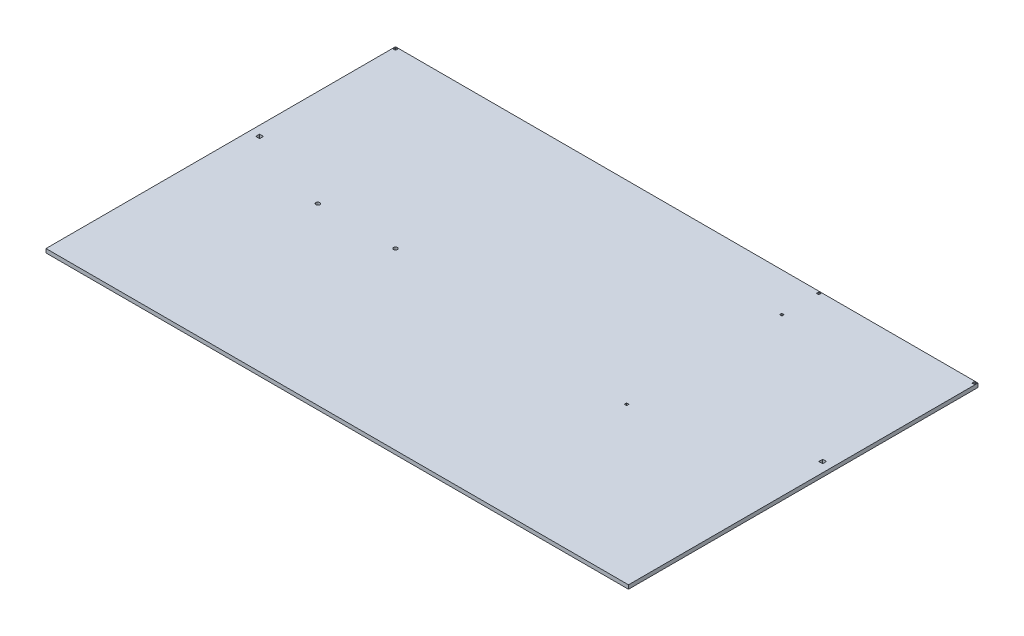
ISO-10303-21;
HEADER;
FILE_DESCRIPTION(('STEP AP214'),'2;1');
FILE_NAME('part.step','',(''),(''),'','','');
FILE_SCHEMA(('AUTOMOTIVE_DESIGN { 1 0 10303 214 1 1 1 1 }'));
ENDSEC;
DATA;
#1=APPLICATION_CONTEXT('core data for automotive mechanical design processes');
#2=APPLICATION_PROTOCOL_DEFINITION('international standard','automotive_design',2000,#1);
#3=PRODUCT_CONTEXT('',#1,'mechanical');
#4=PRODUCT('Part','Part','',(#3));
#5=PRODUCT_RELATED_PRODUCT_CATEGORY('part','',(#4));
#6=PRODUCT_DEFINITION_FORMATION('','',#4);
#7=PRODUCT_DEFINITION_CONTEXT('part definition',#1,'design');
#8=PRODUCT_DEFINITION('design','',#6,#7);
#9=PRODUCT_DEFINITION_SHAPE('','',#8);
#10=(LENGTH_UNIT() NAMED_UNIT(*) SI_UNIT(.MILLI.,.METRE.));
#11=(NAMED_UNIT(*) PLANE_ANGLE_UNIT() SI_UNIT($,.RADIAN.));
#12=(NAMED_UNIT(*) SI_UNIT($,.STERADIAN.) SOLID_ANGLE_UNIT());
#13=UNCERTAINTY_MEASURE_WITH_UNIT(LENGTH_MEASURE(1.E-05),#10,'distance_accuracy_value','');
#14=(GEOMETRIC_REPRESENTATION_CONTEXT(3) GLOBAL_UNCERTAINTY_ASSIGNED_CONTEXT((#13)) GLOBAL_UNIT_ASSIGNED_CONTEXT((#10,
#11,#12)) REPRESENTATION_CONTEXT('',''));
#15=CARTESIAN_POINT('',(0.,0.,0.));
#16=DIRECTION('',(0.,0.,1.));
#17=DIRECTION('',(1.,0.,0.));
#18=AXIS2_PLACEMENT_3D('',#15,#16,#17);
#19=CARTESIAN_POINT('',(-375.,5.,-220.));
#20=DIRECTION('',(0.,-1.,0.));
#21=DIRECTION('',(0.,0.,-1.));
#22=AXIS2_PLACEMENT_3D('',#19,#20,#21);
#23=PLANE('',#22);
#24=DIRECTION('',(-1.,0.,0.));
#25=VECTOR('',#24,1.);
#26=CARTESIAN_POINT('',(-374.,5.,-224.));
#27=LINE('',#26,#25);
#28=CARTESIAN_POINT('',(-371.,5.,-224.));
#29=VERTEX_POINT('',#28);
#30=CARTESIAN_POINT('',(-374.,5.,-224.));
#31=VERTEX_POINT('',#30);
#32=EDGE_CURVE('E289',#29,#31,#27,.T.);
#33=ORIENTED_EDGE('',*,*,#32,.F.);
#34=DIRECTION('',(0.,0.,-1.));
#35=VECTOR('',#34,1.);
#36=CARTESIAN_POINT('',(-371.,5.,-224.));
#37=LINE('',#36,#35);
#38=CARTESIAN_POINT('',(-371.,5.,-221.));
#39=VERTEX_POINT('',#38);
#40=EDGE_CURVE('E58',#39,#29,#37,.T.);
#41=ORIENTED_EDGE('',*,*,#40,.F.);
#42=DIRECTION('',(1.,0.,0.));
#43=VECTOR('',#42,1.);
#44=CARTESIAN_POINT('',(-374.,5.,-221.));
#45=LINE('',#44,#43);
#46=CARTESIAN_POINT('',(-374.,5.,-221.));
#47=VERTEX_POINT('',#46);
#48=EDGE_CURVE('E276',#47,#39,#45,.T.);
#49=ORIENTED_EDGE('',*,*,#48,.F.);
#50=DIRECTION('',(0.,0.,1.));
#51=VECTOR('',#50,1.);
#52=CARTESIAN_POINT('',(-374.,5.,-224.));
#53=LINE('',#52,#51);
#54=EDGE_CURVE('E280',#31,#47,#53,.T.);
#55=ORIENTED_EDGE('',*,*,#54,.F.);
#56=EDGE_LOOP('',(#33,#41,#49,#55));
#57=FACE_BOUND('',#56,.T.);
#58=DIRECTION('',(-1.,0.,0.));
#59=VECTOR('',#58,1.);
#60=CARTESIAN_POINT('',(171.,5.,-176.5));
#61=LINE('',#60,#59);
#62=CARTESIAN_POINT('',(174.,5.,-176.5));
#63=VERTEX_POINT('',#62);
#64=CARTESIAN_POINT('',(171.,5.,-176.5));
#65=VERTEX_POINT('',#64);
#66=EDGE_CURVE('E372',#63,#65,#61,.T.);
#67=ORIENTED_EDGE('',*,*,#66,.F.);
#68=DIRECTION('',(0.,0.,-1.));
#69=VECTOR('',#68,1.);
#70=CARTESIAN_POINT('',(174.,5.,-176.5));
#71=LINE('',#70,#69);
#72=CARTESIAN_POINT('',(174.,5.,-173.5));
#73=VERTEX_POINT('',#72);
#74=EDGE_CURVE('E66',#73,#63,#71,.T.);
#75=ORIENTED_EDGE('',*,*,#74,.F.);
#76=DIRECTION('',(1.,0.,0.));
#77=VECTOR('',#76,1.);
#78=CARTESIAN_POINT('',(171.,5.,-173.5));
#79=LINE('',#78,#77);
#80=CARTESIAN_POINT('',(171.,5.,-173.5));
#81=VERTEX_POINT('',#80);
#82=EDGE_CURVE('E363',#81,#73,#79,.T.);
#83=ORIENTED_EDGE('',*,*,#82,.F.);
#84=DIRECTION('',(0.,0.,1.));
#85=VECTOR('',#84,1.);
#86=CARTESIAN_POINT('',(171.,5.,-176.5));
#87=LINE('',#86,#85);
#88=EDGE_CURVE('E367',#65,#81,#87,.T.);
#89=ORIENTED_EDGE('',*,*,#88,.F.);
#90=EDGE_LOOP('',(#67,#75,#83,#89));
#91=FACE_BOUND('',#90,.T.);
#92=DIRECTION('',(-1.,0.,0.));
#93=VECTOR('',#92,1.);
#94=CARTESIAN_POINT('',(171.,5.,-224.));
#95=LINE('',#94,#93);
#96=CARTESIAN_POINT('',(174.,5.,-224.));
#97=VERTEX_POINT('',#96);
#98=CARTESIAN_POINT('',(171.,5.,-224.));
#99=VERTEX_POINT('',#98);
#100=EDGE_CURVE('E328',#97,#99,#95,.T.);
#101=ORIENTED_EDGE('',*,*,#100,.F.);
#102=DIRECTION('',(0.,0.,-1.));
#103=VECTOR('',#102,1.);
#104=CARTESIAN_POINT('',(174.,5.,-224.));
#105=LINE('',#104,#103);
#106=CARTESIAN_POINT('',(174.,5.,-221.));
#107=VERTEX_POINT('',#106);
#108=EDGE_CURVE('E332',#107,#97,#105,.T.);
#109=ORIENTED_EDGE('',*,*,#108,.F.);
#110=DIRECTION('',(1.,0.,0.));
#111=VECTOR('',#110,1.);
#112=CARTESIAN_POINT('',(171.,5.,-221.));
#113=LINE('',#112,#111);
#114=CARTESIAN_POINT('',(171.,5.,-221.));
#115=VERTEX_POINT('',#114);
#116=EDGE_CURVE('E319',#115,#107,#113,.T.);
#117=ORIENTED_EDGE('',*,*,#116,.F.);
#118=DIRECTION('',(0.,0.,1.));
#119=VECTOR('',#118,1.);
#120=CARTESIAN_POINT('',(171.,5.,-224.));
#121=LINE('',#120,#119);
#122=EDGE_CURVE('E323',#99,#115,#121,.T.);
#123=ORIENTED_EDGE('',*,*,#122,.F.);
#124=EDGE_LOOP('',(#101,#109,#117,#123));
#125=FACE_BOUND('',#124,.T.);
#126=DIRECTION('',(-1.,0.,0.));
#127=VECTOR('',#126,1.);
#128=CARTESIAN_POINT('',(171.,5.,23.5));
#129=LINE('',#128,#127);
#130=CARTESIAN_POINT('',(174.,5.,23.5));
#131=VERTEX_POINT('',#130);
#132=CARTESIAN_POINT('',(171.,5.,23.5));
#133=VERTEX_POINT('',#132);
#134=EDGE_CURVE('E458',#131,#133,#129,.T.);
#135=ORIENTED_EDGE('',*,*,#134,.F.);
#136=DIRECTION('',(0.,0.,-1.));
#137=VECTOR('',#136,1.);
#138=CARTESIAN_POINT('',(174.,5.,23.5));
#139=LINE('',#138,#137);
#140=CARTESIAN_POINT('',(174.,5.,26.5));
#141=VERTEX_POINT('',#140);
#142=EDGE_CURVE('E406',#141,#131,#139,.T.);
#143=ORIENTED_EDGE('',*,*,#142,.F.);
#144=DIRECTION('',(1.,0.,0.));
#145=VECTOR('',#144,1.);
#146=CARTESIAN_POINT('',(171.,5.,26.5));
#147=LINE('',#146,#145);
#148=CARTESIAN_POINT('',(171.,5.,26.5));
#149=VERTEX_POINT('',#148);
#150=EDGE_CURVE('E449',#149,#141,#147,.T.);
#151=ORIENTED_EDGE('',*,*,#150,.F.);
#152=DIRECTION('',(0.,0.,1.));
#153=VECTOR('',#152,1.);
#154=CARTESIAN_POINT('',(171.,5.,23.5));
#155=LINE('',#154,#153);
#156=EDGE_CURVE('E453',#133,#149,#155,.T.);
#157=ORIENTED_EDGE('',*,*,#156,.F.);
#158=EDGE_LOOP('',(#135,#143,#151,#157));
#159=FACE_BOUND('',#158,.T.);
#160=DIRECTION('',(-1.,0.,0.));
#161=VECTOR('',#160,1.);
#162=CARTESIAN_POINT('',(371.,5.,-224.));
#163=LINE('',#162,#161);
#164=CARTESIAN_POINT('',(374.,5.,-224.));
#165=VERTEX_POINT('',#164);
#166=CARTESIAN_POINT('',(371.,5.,-224.));
#167=VERTEX_POINT('',#166);
#168=EDGE_CURVE('E416',#165,#167,#163,.T.);
#169=ORIENTED_EDGE('',*,*,#168,.F.);
#170=DIRECTION('',(0.,0.,-1.));
#171=VECTOR('',#170,1.);
#172=CARTESIAN_POINT('',(374.,5.,-224.));
#173=LINE('',#172,#171);
#174=CARTESIAN_POINT('',(374.,5.,-221.));
#175=VERTEX_POINT('',#174);
#176=EDGE_CURVE('E290',#175,#165,#173,.T.);
#177=ORIENTED_EDGE('',*,*,#176,.F.);
#178=DIRECTION('',(1.,0.,0.));
#179=VECTOR('',#178,1.);
#180=CARTESIAN_POINT('',(371.,5.,-221.));
#181=LINE('',#180,#179);
#182=CARTESIAN_POINT('',(371.,5.,-221.));
#183=VERTEX_POINT('',#182);
#184=EDGE_CURVE('E407',#183,#175,#181,.T.);
#185=ORIENTED_EDGE('',*,*,#184,.F.);
#186=DIRECTION('',(0.,0.,1.));
#187=VECTOR('',#186,1.);
#188=CARTESIAN_POINT('',(371.,5.,-224.));
#189=LINE('',#188,#187);
#190=EDGE_CURVE('E411',#167,#183,#189,.T.);
#191=ORIENTED_EDGE('',*,*,#190,.F.);
#192=EDGE_LOOP('',(#169,#177,#185,#191));
#193=FACE_BOUND('',#192,.T.);
#194=CARTESIAN_POINT('',(-250.,5.,0.));
#195=DIRECTION('',(0.,1.,0.));
#196=DIRECTION('',(0.,0.,1.));
#197=AXIS2_PLACEMENT_3D('',#194,#195,#196);
#198=CIRCLE('',#197,2.5);
#199=CARTESIAN_POINT('',(-250.,5.,2.5));
#200=VERTEX_POINT('',#199);
#201=EDGE_CURVE('E483',#200,#200,#198,.T.);
#202=ORIENTED_EDGE('',*,*,#201,.F.);
#203=EDGE_LOOP('',(#202));
#204=FACE_BOUND('',#203,.T.);
#205=CARTESIAN_POINT('',(-150.,5.,0.));
#206=DIRECTION('',(0.,1.,0.));
#207=DIRECTION('',(0.,0.,1.));
#208=AXIS2_PLACEMENT_3D('',#205,#206,#207);
#209=CIRCLE('',#208,2.5);
#210=CARTESIAN_POINT('',(-150.,5.,2.5));
#211=VERTEX_POINT('',#210);
#212=EDGE_CURVE('E487',#211,#211,#209,.T.);
#213=ORIENTED_EDGE('',*,*,#212,.F.);
#214=EDGE_LOOP('',(#213));
#215=FACE_BOUND('',#214,.T.);
#216=DIRECTION('',(-1.,0.,0.));
#217=VECTOR('',#216,1.);
#218=CARTESIAN_POINT('',(-375.,5.,-35.0000000000001));
#219=LINE('',#218,#217);
#220=CARTESIAN_POINT('',(-360.,5.,-35.0000000000001));
#221=VERTEX_POINT('',#220);
#222=CARTESIAN_POINT('',(-365.,5.,-35.0000000000001));
#223=VERTEX_POINT('',#222);
#224=EDGE_CURVE('E571',#221,#223,#219,.T.);
#225=ORIENTED_EDGE('',*,*,#224,.T.);
#226=DIRECTION('',(0.,0.,-1.));
#227=VECTOR('',#226,1.);
#228=CARTESIAN_POINT('',(-364.999999999998,5.,-220.));
#229=LINE('',#228,#227);
#230=CARTESIAN_POINT('',(-365.,5.,-40.0000000000001));
#231=VERTEX_POINT('',#230);
#232=EDGE_CURVE('E583',#223,#231,#229,.T.);
#233=ORIENTED_EDGE('',*,*,#232,.T.);
#234=DIRECTION('',(1.,0.,0.));
#235=VECTOR('',#234,1.);
#236=CARTESIAN_POINT('',(-375.,5.,-40.0000000000001));
#237=LINE('',#236,#235);
#238=CARTESIAN_POINT('',(-360.,5.,-40.0000000000001));
#239=VERTEX_POINT('',#238);
#240=EDGE_CURVE('E579',#231,#239,#237,.T.);
#241=ORIENTED_EDGE('',*,*,#240,.T.);
#242=DIRECTION('',(0.,0.,1.));
#243=VECTOR('',#242,1.);
#244=CARTESIAN_POINT('',(-360.,5.,-220.));
#245=LINE('',#244,#243);
#246=EDGE_CURVE('E575',#239,#221,#245,.T.);
#247=ORIENTED_EDGE('',*,*,#246,.T.);
#248=EDGE_LOOP('',(#225,#233,#241,#247));
#249=FACE_BOUND('',#248,.T.);
#250=DIRECTION('',(-1.,0.,0.));
#251=VECTOR('',#250,1.);
#252=CARTESIAN_POINT('',(-375.,5.,-35.0000000000001));
#253=LINE('',#252,#251);
#254=CARTESIAN_POINT('',(365.,5.,-35.0000000000001));
#255=VERTEX_POINT('',#254);
#256=CARTESIAN_POINT('',(360.,5.,-35.0000000000001));
#257=VERTEX_POINT('',#256);
#258=EDGE_CURVE('E516',#255,#257,#253,.T.);
#259=ORIENTED_EDGE('',*,*,#258,.T.);
#260=DIRECTION('',(0.,0.,-1.));
#261=VECTOR('',#260,1.);
#262=CARTESIAN_POINT('',(360.,5.,-220.));
#263=LINE('',#262,#261);
#264=CARTESIAN_POINT('',(360.,5.,-40.0000000000001));
#265=VERTEX_POINT('',#264);
#266=EDGE_CURVE('E567',#257,#265,#263,.T.);
#267=ORIENTED_EDGE('',*,*,#266,.T.);
#268=DIRECTION('',(1.,0.,0.));
#269=VECTOR('',#268,1.);
#270=CARTESIAN_POINT('',(-375.,5.,-40.0000000000001));
#271=LINE('',#270,#269);
#272=CARTESIAN_POINT('',(365.,5.,-40.0000000000001));
#273=VERTEX_POINT('',#272);
#274=EDGE_CURVE('E563',#265,#273,#271,.T.);
#275=ORIENTED_EDGE('',*,*,#274,.T.);
#276=DIRECTION('',(0.,0.,1.));
#277=VECTOR('',#276,1.);
#278=CARTESIAN_POINT('',(365.,5.,-220.));
#279=LINE('',#278,#277);
#280=EDGE_CURVE('E559',#273,#255,#279,.T.);
#281=ORIENTED_EDGE('',*,*,#280,.T.);
#282=EDGE_LOOP('',(#259,#267,#275,#281));
#283=FACE_BOUND('',#282,.T.);
#284=DIRECTION('',(-1.,0.,0.));
#285=VECTOR('',#284,1.);
#286=CARTESIAN_POINT('',(-375.,5.,-225.));
#287=LINE('',#286,#285);
#288=CARTESIAN_POINT('',(375.,5.,-225.));
#289=VERTEX_POINT('',#288);
#290=CARTESIAN_POINT('',(-375.,5.,-225.));
#291=VERTEX_POINT('',#290);
#292=EDGE_CURVE('E11',#289,#291,#287,.T.);
#293=ORIENTED_EDGE('',*,*,#292,.T.);
#294=DIRECTION('',(0.,0.,1.));
#295=VECTOR('',#294,1.);
#296=CARTESIAN_POINT('',(-375.,5.,-220.));
#297=LINE('',#296,#295);
#298=CARTESIAN_POINT('',(-375.,5.,225.));
#299=VERTEX_POINT('',#298);
#300=EDGE_CURVE('E590',#291,#299,#297,.T.);
#301=ORIENTED_EDGE('',*,*,#300,.T.);
#302=DIRECTION('',(1.,0.,0.));
#303=VECTOR('',#302,1.);
#304=CARTESIAN_POINT('',(-375.,5.,225.));
#305=LINE('',#304,#303);
#306=CARTESIAN_POINT('',(375.,5.,225.));
#307=VERTEX_POINT('',#306);
#308=EDGE_CURVE('E587',#299,#307,#305,.T.);
#309=ORIENTED_EDGE('',*,*,#308,.T.);
#310=DIRECTION('',(0.,0.,1.));
#311=VECTOR('',#310,1.);
#312=CARTESIAN_POINT('',(375.,5.,-220.));
#313=LINE('',#312,#311);
#314=EDGE_CURVE('E591',#289,#307,#313,.T.);
#315=ORIENTED_EDGE('',*,*,#314,.F.);
#316=EDGE_LOOP('',(#293,#301,#309,#315));
#317=FACE_BOUND('',#316,.T.);
#318=ADVANCED_FACE('F42',(#57,#91,#125,#159,#193,#204,#215,#249,#283,#317),#23,.F.);
#319=CARTESIAN_POINT('',(360.,0.,-40.0000000000001));
#320=DIRECTION('',(0.,0.,-1.));
#321=DIRECTION('',(-1.,0.,0.));
#322=AXIS2_PLACEMENT_3D('',#319,#320,#321);
#323=PLANE('',#322);
#324=DIRECTION('',(0.,1.,0.));
#325=VECTOR('',#324,1.);
#326=CARTESIAN_POINT('',(360.,0.,-40.0000000000001));
#327=LINE('',#326,#325);
#328=CARTESIAN_POINT('',(360.,0.,-40.0000000000001));
#329=VERTEX_POINT('',#328);
#330=EDGE_CURVE('E482',#329,#265,#327,.T.);
#331=ORIENTED_EDGE('',*,*,#330,.F.);
#332=DIRECTION('',(-1.,0.,0.));
#333=VECTOR('',#332,1.);
#334=CARTESIAN_POINT('',(360.,0.,-40.0000000000001));
#335=LINE('',#334,#333);
#336=CARTESIAN_POINT('',(365.,0.,-40.0000000000001));
#337=VERTEX_POINT('',#336);
#338=EDGE_CURVE('E530',#337,#329,#335,.T.);
#339=ORIENTED_EDGE('',*,*,#338,.F.);
#340=DIRECTION('',(0.,1.,0.));
#341=VECTOR('',#340,1.);
#342=CARTESIAN_POINT('',(365.,0.,-40.0000000000001));
#343=LINE('',#342,#341);
#344=EDGE_CURVE('E535',#337,#273,#343,.T.);
#345=ORIENTED_EDGE('',*,*,#344,.T.);
#346=ORIENTED_EDGE('',*,*,#274,.F.);
#347=EDGE_LOOP('',(#331,#339,#345,#346));
#348=FACE_BOUND('',#347,.T.);
#349=ADVANCED_FACE('F642',(#348),#323,.F.);
#350=CARTESIAN_POINT('',(360.,0.,-40.0000000000001));
#351=DIRECTION('',(-1.,0.,0.));
#352=DIRECTION('',(0.,0.,1.));
#353=AXIS2_PLACEMENT_3D('',#350,#351,#352);
#354=PLANE('',#353);
#355=DIRECTION('',(0.,1.,0.));
#356=VECTOR('',#355,1.);
#357=CARTESIAN_POINT('',(360.,0.,-35.0000000000001));
#358=LINE('',#357,#356);
#359=CARTESIAN_POINT('',(360.,0.,-35.0000000000001));
#360=VERTEX_POINT('',#359);
#361=EDGE_CURVE('E527',#360,#257,#358,.T.);
#362=ORIENTED_EDGE('',*,*,#361,.F.);
#363=DIRECTION('',(0.,0.,1.));
#364=VECTOR('',#363,1.);
#365=CARTESIAN_POINT('',(360.,0.,-40.0000000000001));
#366=LINE('',#365,#364);
#367=EDGE_CURVE('E499',#329,#360,#366,.T.);
#368=ORIENTED_EDGE('',*,*,#367,.F.);
#369=ORIENTED_EDGE('',*,*,#330,.T.);
#370=ORIENTED_EDGE('',*,*,#266,.F.);
#371=EDGE_LOOP('',(#362,#368,#369,#370));
#372=FACE_BOUND('',#371,.T.);
#373=ADVANCED_FACE('F648',(#372),#354,.F.);
#374=CARTESIAN_POINT('',(-365.,0.,-40.0000000000001));
#375=DIRECTION('',(0.,0.,-1.));
#376=DIRECTION('',(-1.,0.,0.));
#377=AXIS2_PLACEMENT_3D('',#374,#375,#376);
#378=PLANE('',#377);
#379=DIRECTION('',(0.,1.,0.));
#380=VECTOR('',#379,1.);
#381=CARTESIAN_POINT('',(-365.,0.,-40.0000000000001));
#382=LINE('',#381,#380);
#383=CARTESIAN_POINT('',(-365.,0.,-40.0000000000001));
#384=VERTEX_POINT('',#383);
#385=EDGE_CURVE('E512',#384,#231,#382,.T.);
#386=ORIENTED_EDGE('',*,*,#385,.F.);
#387=DIRECTION('',(-1.,0.,0.));
#388=VECTOR('',#387,1.);
#389=CARTESIAN_POINT('',(-365.,0.,-40.0000000000001));
#390=LINE('',#389,#388);
#391=CARTESIAN_POINT('',(-360.,0.,-40.0000000000001));
#392=VERTEX_POINT('',#391);
#393=EDGE_CURVE('E507',#392,#384,#390,.T.);
#394=ORIENTED_EDGE('',*,*,#393,.F.);
#395=DIRECTION('',(0.,1.,0.));
#396=VECTOR('',#395,1.);
#397=CARTESIAN_POINT('',(-360.,0.,-40.0000000000001));
#398=LINE('',#397,#396);
#399=EDGE_CURVE('E517',#392,#239,#398,.T.);
#400=ORIENTED_EDGE('',*,*,#399,.T.);
#401=ORIENTED_EDGE('',*,*,#240,.F.);
#402=EDGE_LOOP('',(#386,#394,#400,#401));
#403=FACE_BOUND('',#402,.T.);
#404=ADVANCED_FACE('F676',(#403),#378,.F.);
#405=CARTESIAN_POINT('',(-365.,0.,-40.0000000000001));
#406=DIRECTION('',(-1.,0.,0.));
#407=DIRECTION('',(0.,0.,1.));
#408=AXIS2_PLACEMENT_3D('',#405,#406,#407);
#409=PLANE('',#408);
#410=DIRECTION('',(0.,1.,0.));
#411=VECTOR('',#410,1.);
#412=CARTESIAN_POINT('',(-365.,0.,-35.0000000000001));
#413=LINE('',#412,#411);
#414=CARTESIAN_POINT('',(-365.,0.,-35.0000000000001));
#415=VERTEX_POINT('',#414);
#416=EDGE_CURVE('E511',#415,#223,#413,.T.);
#417=ORIENTED_EDGE('',*,*,#416,.F.);
#418=DIRECTION('',(0.,0.,1.));
#419=VECTOR('',#418,1.);
#420=CARTESIAN_POINT('',(-365.,0.,-40.0000000000001));
#421=LINE('',#420,#419);
#422=EDGE_CURVE('E494',#384,#415,#421,.T.);
#423=ORIENTED_EDGE('',*,*,#422,.F.);
#424=ORIENTED_EDGE('',*,*,#385,.T.);
#425=ORIENTED_EDGE('',*,*,#232,.F.);
#426=EDGE_LOOP('',(#417,#423,#424,#425));
#427=FACE_BOUND('',#426,.T.);
#428=ADVANCED_FACE('F668',(#427),#409,.F.);
#429=CARTESIAN_POINT('',(0.,0.,0.));
#430=DIRECTION('',(0.,1.,0.));
#431=DIRECTION('',(0.,0.,1.));
#432=AXIS2_PLACEMENT_3D('',#429,#430,#431);
#433=PLANE('',#432);
#434=DIRECTION('',(1.,0.,0.));
#435=VECTOR('',#434,1.);
#436=CARTESIAN_POINT('',(-374.,0.,-221.));
#437=LINE('',#436,#435);
#438=CARTESIAN_POINT('',(-374.,0.,-221.));
#439=VERTEX_POINT('',#438);
#440=CARTESIAN_POINT('',(-371.,0.,-221.));
#441=VERTEX_POINT('',#440);
#442=EDGE_CURVE('E261',#439,#441,#437,.T.);
#443=ORIENTED_EDGE('',*,*,#442,.T.);
#444=DIRECTION('',(0.,0.,-1.));
#445=VECTOR('',#444,1.);
#446=CARTESIAN_POINT('',(-371.,0.,-224.));
#447=LINE('',#446,#445);
#448=CARTESIAN_POINT('',(-371.,0.,-224.));
#449=VERTEX_POINT('',#448);
#450=EDGE_CURVE('E254',#441,#449,#447,.T.);
#451=ORIENTED_EDGE('',*,*,#450,.T.);
#452=DIRECTION('',(-1.,0.,0.));
#453=VECTOR('',#452,1.);
#454=CARTESIAN_POINT('',(-374.,0.,-224.));
#455=LINE('',#454,#453);
#456=CARTESIAN_POINT('',(-374.,0.,-224.));
#457=VERTEX_POINT('',#456);
#458=EDGE_CURVE('E265',#449,#457,#455,.T.);
#459=ORIENTED_EDGE('',*,*,#458,.T.);
#460=DIRECTION('',(0.,0.,1.));
#461=VECTOR('',#460,1.);
#462=CARTESIAN_POINT('',(-374.,0.,-224.));
#463=LINE('',#462,#461);
#464=EDGE_CURVE('E270',#457,#439,#463,.T.);
#465=ORIENTED_EDGE('',*,*,#464,.T.);
#466=EDGE_LOOP('',(#443,#451,#459,#465));
#467=FACE_BOUND('',#466,.T.);
#468=DIRECTION('',(1.,0.,0.));
#469=VECTOR('',#468,1.);
#470=CARTESIAN_POINT('',(171.,0.,-173.5));
#471=LINE('',#470,#469);
#472=CARTESIAN_POINT('',(171.,0.,-173.5));
#473=VERTEX_POINT('',#472);
#474=CARTESIAN_POINT('',(174.,0.,-173.5));
#475=VERTEX_POINT('',#474);
#476=EDGE_CURVE('E353',#473,#475,#471,.T.);
#477=ORIENTED_EDGE('',*,*,#476,.T.);
#478=DIRECTION('',(0.,0.,-1.));
#479=VECTOR('',#478,1.);
#480=CARTESIAN_POINT('',(174.,0.,-176.5));
#481=LINE('',#480,#479);
#482=CARTESIAN_POINT('',(174.,0.,-176.5));
#483=VERTEX_POINT('',#482);
#484=EDGE_CURVE('E368',#475,#483,#481,.T.);
#485=ORIENTED_EDGE('',*,*,#484,.T.);
#486=DIRECTION('',(-1.,0.,0.));
#487=VECTOR('',#486,1.);
#488=CARTESIAN_POINT('',(171.,0.,-176.5));
#489=LINE('',#488,#487);
#490=CARTESIAN_POINT('',(171.,0.,-176.5));
#491=VERTEX_POINT('',#490);
#492=EDGE_CURVE('E385',#483,#491,#489,.T.);
#493=ORIENTED_EDGE('',*,*,#492,.T.);
#494=DIRECTION('',(0.,0.,1.));
#495=VECTOR('',#494,1.);
#496=CARTESIAN_POINT('',(171.,0.,-176.5));
#497=LINE('',#496,#495);
#498=EDGE_CURVE('E381',#491,#473,#497,.T.);
#499=ORIENTED_EDGE('',*,*,#498,.T.);
#500=EDGE_LOOP('',(#477,#485,#493,#499));
#501=FACE_BOUND('',#500,.T.);
#502=DIRECTION('',(1.,0.,0.));
#503=VECTOR('',#502,1.);
#504=CARTESIAN_POINT('',(171.,0.,-221.));
#505=LINE('',#504,#503);
#506=CARTESIAN_POINT('',(171.,0.,-221.));
#507=VERTEX_POINT('',#506);
#508=CARTESIAN_POINT('',(174.,0.,-221.));
#509=VERTEX_POINT('',#508);
#510=EDGE_CURVE('E309',#507,#509,#505,.T.);
#511=ORIENTED_EDGE('',*,*,#510,.T.);
#512=DIRECTION('',(0.,0.,-1.));
#513=VECTOR('',#512,1.);
#514=CARTESIAN_POINT('',(174.,0.,-224.));
#515=LINE('',#514,#513);
#516=CARTESIAN_POINT('',(174.,0.,-224.));
#517=VERTEX_POINT('',#516);
#518=EDGE_CURVE('E324',#509,#517,#515,.T.);
#519=ORIENTED_EDGE('',*,*,#518,.T.);
#520=DIRECTION('',(-1.,0.,0.));
#521=VECTOR('',#520,1.);
#522=CARTESIAN_POINT('',(171.,0.,-224.));
#523=LINE('',#522,#521);
#524=CARTESIAN_POINT('',(171.,0.,-224.));
#525=VERTEX_POINT('',#524);
#526=EDGE_CURVE('E343',#517,#525,#523,.T.);
#527=ORIENTED_EDGE('',*,*,#526,.T.);
#528=DIRECTION('',(0.,0.,1.));
#529=VECTOR('',#528,1.);
#530=CARTESIAN_POINT('',(171.,0.,-224.));
#531=LINE('',#530,#529);
#532=EDGE_CURVE('E339',#525,#507,#531,.T.);
#533=ORIENTED_EDGE('',*,*,#532,.T.);
#534=EDGE_LOOP('',(#511,#519,#527,#533));
#535=FACE_BOUND('',#534,.T.);
#536=DIRECTION('',(1.,0.,0.));
#537=VECTOR('',#536,1.);
#538=CARTESIAN_POINT('',(171.,0.,26.5));
#539=LINE('',#538,#537);
#540=CARTESIAN_POINT('',(171.,0.,26.5));
#541=VERTEX_POINT('',#540);
#542=CARTESIAN_POINT('',(174.,0.,26.5));
#543=VERTEX_POINT('',#542);
#544=EDGE_CURVE('E440',#541,#543,#539,.T.);
#545=ORIENTED_EDGE('',*,*,#544,.T.);
#546=DIRECTION('',(0.,0.,-1.));
#547=VECTOR('',#546,1.);
#548=CARTESIAN_POINT('',(174.,0.,23.5));
#549=LINE('',#548,#547);
#550=CARTESIAN_POINT('',(174.,0.,23.5));
#551=VERTEX_POINT('',#550);
#552=EDGE_CURVE('E454',#543,#551,#549,.T.);
#553=ORIENTED_EDGE('',*,*,#552,.T.);
#554=DIRECTION('',(-1.,0.,0.));
#555=VECTOR('',#554,1.);
#556=CARTESIAN_POINT('',(171.,0.,23.5));
#557=LINE('',#556,#555);
#558=CARTESIAN_POINT('',(171.,0.,23.5));
#559=VERTEX_POINT('',#558);
#560=EDGE_CURVE('E471',#551,#559,#557,.T.);
#561=ORIENTED_EDGE('',*,*,#560,.T.);
#562=DIRECTION('',(0.,0.,1.));
#563=VECTOR('',#562,1.);
#564=CARTESIAN_POINT('',(171.,0.,23.5));
#565=LINE('',#564,#563);
#566=EDGE_CURVE('E467',#559,#541,#565,.T.);
#567=ORIENTED_EDGE('',*,*,#566,.T.);
#568=EDGE_LOOP('',(#545,#553,#561,#567));
#569=FACE_BOUND('',#568,.T.);
#570=DIRECTION('',(1.,0.,0.));
#571=VECTOR('',#570,1.);
#572=CARTESIAN_POINT('',(371.,0.,-221.));
#573=LINE('',#572,#571);
#574=CARTESIAN_POINT('',(371.,0.,-221.));
#575=VERTEX_POINT('',#574);
#576=CARTESIAN_POINT('',(374.,0.,-221.));
#577=VERTEX_POINT('',#576);
#578=EDGE_CURVE('E396',#575,#577,#573,.T.);
#579=ORIENTED_EDGE('',*,*,#578,.T.);
#580=DIRECTION('',(0.,0.,-1.));
#581=VECTOR('',#580,1.);
#582=CARTESIAN_POINT('',(374.,0.,-224.));
#583=LINE('',#582,#581);
#584=CARTESIAN_POINT('',(374.,0.,-224.));
#585=VERTEX_POINT('',#584);
#586=EDGE_CURVE('E412',#577,#585,#583,.T.);
#587=ORIENTED_EDGE('',*,*,#586,.T.);
#588=DIRECTION('',(-1.,0.,0.));
#589=VECTOR('',#588,1.);
#590=CARTESIAN_POINT('',(371.,0.,-224.));
#591=LINE('',#590,#589);
#592=CARTESIAN_POINT('',(371.,0.,-224.));
#593=VERTEX_POINT('',#592);
#594=EDGE_CURVE('E429',#585,#593,#591,.T.);
#595=ORIENTED_EDGE('',*,*,#594,.T.);
#596=DIRECTION('',(0.,0.,1.));
#597=VECTOR('',#596,1.);
#598=CARTESIAN_POINT('',(371.,0.,-224.));
#599=LINE('',#598,#597);
#600=EDGE_CURVE('E425',#593,#575,#599,.T.);
#601=ORIENTED_EDGE('',*,*,#600,.T.);
#602=EDGE_LOOP('',(#579,#587,#595,#601));
#603=FACE_BOUND('',#602,.T.);
#604=CARTESIAN_POINT('',(-250.,0.,0.));
#605=DIRECTION('',(0.,1.,0.));
#606=DIRECTION('',(0.,0.,1.));
#607=AXIS2_PLACEMENT_3D('',#604,#605,#606);
#608=CIRCLE('',#607,2.5);
#609=CARTESIAN_POINT('',(-250.,0.,2.5));
#610=VERTEX_POINT('',#609);
#611=EDGE_CURVE('E478',#610,#610,#608,.T.);
#612=ORIENTED_EDGE('',*,*,#611,.T.);
#613=EDGE_LOOP('',(#612));
#614=FACE_BOUND('',#613,.T.);
#615=CARTESIAN_POINT('',(-150.,0.,0.));
#616=DIRECTION('',(0.,1.,0.));
#617=DIRECTION('',(0.,0.,1.));
#618=AXIS2_PLACEMENT_3D('',#615,#616,#617);
#619=CIRCLE('',#618,2.5);
#620=CARTESIAN_POINT('',(-150.,0.,2.5));
#621=VERTEX_POINT('',#620);
#622=EDGE_CURVE('E299',#621,#621,#619,.T.);
#623=ORIENTED_EDGE('',*,*,#622,.T.);
#624=EDGE_LOOP('',(#623));
#625=FACE_BOUND('',#624,.T.);
#626=ORIENTED_EDGE('',*,*,#393,.T.);
#627=ORIENTED_EDGE('',*,*,#422,.T.);
#628=DIRECTION('',(1.,0.,0.));
#629=VECTOR('',#628,1.);
#630=CARTESIAN_POINT('',(-365.,0.,-35.0000000000001));
#631=LINE('',#630,#629);
#632=CARTESIAN_POINT('',(-360.,0.,-35.0000000000001));
#633=VERTEX_POINT('',#632);
#634=EDGE_CURVE('E498',#415,#633,#631,.T.);
#635=ORIENTED_EDGE('',*,*,#634,.T.);
#636=DIRECTION('',(0.,0.,-1.));
#637=VECTOR('',#636,1.);
#638=CARTESIAN_POINT('',(-360.,0.,-40.0000000000001));
#639=LINE('',#638,#637);
#640=EDGE_CURVE('E503',#633,#392,#639,.T.);
#641=ORIENTED_EDGE('',*,*,#640,.T.);
#642=EDGE_LOOP('',(#626,#627,#635,#641));
#643=FACE_BOUND('',#642,.T.);
#644=ORIENTED_EDGE('',*,*,#338,.T.);
#645=ORIENTED_EDGE('',*,*,#367,.T.);
#646=DIRECTION('',(1.,0.,0.));
#647=VECTOR('',#646,1.);
#648=CARTESIAN_POINT('',(360.,0.,-35.0000000000001));
#649=LINE('',#648,#647);
#650=CARTESIAN_POINT('',(365.,0.,-35.0000000000001));
#651=VERTEX_POINT('',#650);
#652=EDGE_CURVE('E549',#360,#651,#649,.T.);
#653=ORIENTED_EDGE('',*,*,#652,.T.);
#654=DIRECTION('',(0.,0.,-1.));
#655=VECTOR('',#654,1.);
#656=CARTESIAN_POINT('',(365.,0.,-40.0000000000001));
#657=LINE('',#656,#655);
#658=EDGE_CURVE('E545',#651,#337,#657,.T.);
#659=ORIENTED_EDGE('',*,*,#658,.T.);
#660=EDGE_LOOP('',(#644,#645,#653,#659));
#661=FACE_BOUND('',#660,.T.);
#662=DIRECTION('',(0.,0.,-1.));
#663=VECTOR('',#662,1.);
#664=CARTESIAN_POINT('',(375.,0.,-225.));
#665=LINE('',#664,#663);
#666=CARTESIAN_POINT('',(375.,0.,225.));
#667=VERTEX_POINT('',#666);
#668=CARTESIAN_POINT('',(375.,0.,-225.));
#669=VERTEX_POINT('',#668);
#670=EDGE_CURVE('E595',#667,#669,#665,.T.);
#671=ORIENTED_EDGE('',*,*,#670,.F.);
#672=DIRECTION('',(1.,0.,0.));
#673=VECTOR('',#672,1.);
#674=CARTESIAN_POINT('',(-375.,0.,225.));
#675=LINE('',#674,#673);
#676=CARTESIAN_POINT('',(-375.,0.,225.));
#677=VERTEX_POINT('',#676);
#678=EDGE_CURVE('E609',#677,#667,#675,.T.);
#679=ORIENTED_EDGE('',*,*,#678,.F.);
#680=DIRECTION('',(0.,0.,1.));
#681=VECTOR('',#680,1.);
#682=CARTESIAN_POINT('',(-375.,0.,-225.));
#683=LINE('',#682,#681);
#684=CARTESIAN_POINT('',(-375.,0.,-225.));
#685=VERTEX_POINT('',#684);
#686=EDGE_CURVE('E605',#685,#677,#683,.T.);
#687=ORIENTED_EDGE('',*,*,#686,.F.);
#688=DIRECTION('',(-1.,0.,0.));
#689=VECTOR('',#688,1.);
#690=CARTESIAN_POINT('',(-375.,0.,-225.));
#691=LINE('',#690,#689);
#692=EDGE_CURVE('E601',#669,#685,#691,.T.);
#693=ORIENTED_EDGE('',*,*,#692,.F.);
#694=EDGE_LOOP('',(#671,#679,#687,#693));
#695=FACE_BOUND('',#694,.T.);
#696=ADVANCED_FACE('F272',(#467,#501,#535,#569,#603,#614,#625,#643,#661,#695),#433,.F.);
#697=CARTESIAN_POINT('',(-250.,0.,0.));
#698=DIRECTION('',(0.,1.,0.));
#699=DIRECTION('',(0.,0.,1.));
#700=AXIS2_PLACEMENT_3D('',#697,#698,#699);
#701=CYLINDRICAL_SURFACE('',#700,2.5);
#702=ORIENTED_EDGE('',*,*,#611,.F.);
#703=EDGE_LOOP('',(#702));
#704=FACE_BOUND('',#703,.T.);
#705=ORIENTED_EDGE('',*,*,#201,.T.);
#706=EDGE_LOOP('',(#705));
#707=FACE_BOUND('',#706,.T.);
#708=ADVANCED_FACE('F667',(#704,#707),#701,.F.);
#709=CARTESIAN_POINT('',(-150.,0.,0.));
#710=DIRECTION('',(0.,1.,0.));
#711=DIRECTION('',(0.,0.,1.));
#712=AXIS2_PLACEMENT_3D('',#709,#710,#711);
#713=CYLINDRICAL_SURFACE('',#712,2.5);
#714=ORIENTED_EDGE('',*,*,#622,.F.);
#715=EDGE_LOOP('',(#714));
#716=FACE_BOUND('',#715,.T.);
#717=ORIENTED_EDGE('',*,*,#212,.T.);
#718=EDGE_LOOP('',(#717));
#719=FACE_BOUND('',#718,.T.);
#720=ADVANCED_FACE('F673',(#716,#719),#713,.F.);
#721=CARTESIAN_POINT('',(-360.,0.,-40.0000000000001));
#722=DIRECTION('',(1.,0.,0.));
#723=DIRECTION('',(0.,0.,-1.));
#724=AXIS2_PLACEMENT_3D('',#721,#722,#723);
#725=PLANE('',#724);
#726=ORIENTED_EDGE('',*,*,#399,.F.);
#727=ORIENTED_EDGE('',*,*,#640,.F.);
#728=DIRECTION('',(0.,1.,0.));
#729=VECTOR('',#728,1.);
#730=CARTESIAN_POINT('',(-360.,0.,-35.0000000000001));
#731=LINE('',#730,#729);
#732=EDGE_CURVE('E521',#633,#221,#731,.T.);
#733=ORIENTED_EDGE('',*,*,#732,.T.);
#734=ORIENTED_EDGE('',*,*,#246,.F.);
#735=EDGE_LOOP('',(#726,#727,#733,#734));
#736=FACE_BOUND('',#735,.T.);
#737=ADVANCED_FACE('F700',(#736),#725,.F.);
#738=CARTESIAN_POINT('',(-365.,0.,-35.0000000000001));
#739=DIRECTION('',(0.,0.,1.));
#740=DIRECTION('',(1.,0.,0.));
#741=AXIS2_PLACEMENT_3D('',#738,#739,#740);
#742=PLANE('',#741);
#743=ORIENTED_EDGE('',*,*,#732,.F.);
#744=ORIENTED_EDGE('',*,*,#634,.F.);
#745=ORIENTED_EDGE('',*,*,#416,.T.);
#746=ORIENTED_EDGE('',*,*,#224,.F.);
#747=EDGE_LOOP('',(#743,#744,#745,#746));
#748=FACE_BOUND('',#747,.T.);
#749=ADVANCED_FACE('F686',(#748),#742,.F.);
#750=CARTESIAN_POINT('',(365.,0.,-40.0000000000001));
#751=DIRECTION('',(1.,0.,0.));
#752=DIRECTION('',(0.,0.,-1.));
#753=AXIS2_PLACEMENT_3D('',#750,#751,#752);
#754=PLANE('',#753);
#755=ORIENTED_EDGE('',*,*,#344,.F.);
#756=ORIENTED_EDGE('',*,*,#658,.F.);
#757=DIRECTION('',(0.,1.,0.));
#758=VECTOR('',#757,1.);
#759=CARTESIAN_POINT('',(365.,0.,-35.0000000000001));
#760=LINE('',#759,#758);
#761=EDGE_CURVE('E531',#651,#255,#760,.T.);
#762=ORIENTED_EDGE('',*,*,#761,.T.);
#763=ORIENTED_EDGE('',*,*,#280,.F.);
#764=EDGE_LOOP('',(#755,#756,#762,#763));
#765=FACE_BOUND('',#764,.T.);
#766=ADVANCED_FACE('F693',(#765),#754,.F.);
#767=CARTESIAN_POINT('',(360.,0.,-35.0000000000001));
#768=DIRECTION('',(0.,0.,1.));
#769=DIRECTION('',(1.,0.,0.));
#770=AXIS2_PLACEMENT_3D('',#767,#768,#769);
#771=PLANE('',#770);
#772=ORIENTED_EDGE('',*,*,#761,.F.);
#773=ORIENTED_EDGE('',*,*,#652,.F.);
#774=ORIENTED_EDGE('',*,*,#361,.T.);
#775=ORIENTED_EDGE('',*,*,#258,.F.);
#776=EDGE_LOOP('',(#772,#773,#774,#775));
#777=FACE_BOUND('',#776,.T.);
#778=ADVANCED_FACE('F665',(#777),#771,.F.);
#779=CARTESIAN_POINT('',(-375.,310.,-225.));
#780=DIRECTION('',(1.,0.,0.));
#781=DIRECTION('',(0.,0.,-1.));
#782=AXIS2_PLACEMENT_3D('',#779,#780,#781);
#783=PLANE('',#782);
#784=ORIENTED_EDGE('',*,*,#300,.F.);
#785=DIRECTION('',(0.,-1.,0.));
#786=VECTOR('',#785,1.);
#787=CARTESIAN_POINT('',(-375.,310.,-225.));
#788=LINE('',#787,#786);
#789=EDGE_CURVE('E619',#291,#685,#788,.T.);
#790=ORIENTED_EDGE('',*,*,#789,.T.);
#791=ORIENTED_EDGE('',*,*,#686,.T.);
#792=DIRECTION('',(0.,-1.,0.));
#793=VECTOR('',#792,1.);
#794=CARTESIAN_POINT('',(-375.,310.,225.));
#795=LINE('',#794,#793);
#796=EDGE_CURVE('E616',#299,#677,#795,.T.);
#797=ORIENTED_EDGE('',*,*,#796,.F.);
#798=EDGE_LOOP('',(#784,#790,#791,#797));
#799=FACE_BOUND('',#798,.T.);
#800=ADVANCED_FACE('F639',(#799),#783,.F.);
#801=CARTESIAN_POINT('',(375.,310.,-225.));
#802=DIRECTION('',(-1.,0.,0.));
#803=DIRECTION('',(0.,0.,1.));
#804=AXIS2_PLACEMENT_3D('',#801,#802,#803);
#805=PLANE('',#804);
#806=DIRECTION('',(0.,-1.,0.));
#807=VECTOR('',#806,1.);
#808=CARTESIAN_POINT('',(375.,310.,-225.));
#809=LINE('',#808,#807);
#810=EDGE_CURVE('E51',#289,#669,#809,.T.);
#811=ORIENTED_EDGE('',*,*,#810,.F.);
#812=ORIENTED_EDGE('',*,*,#314,.T.);
#813=DIRECTION('',(0.,-1.,0.));
#814=VECTOR('',#813,1.);
#815=CARTESIAN_POINT('',(375.,310.,225.));
#816=LINE('',#815,#814);
#817=EDGE_CURVE('E613',#307,#667,#816,.T.);
#818=ORIENTED_EDGE('',*,*,#817,.T.);
#819=ORIENTED_EDGE('',*,*,#670,.T.);
#820=EDGE_LOOP('',(#811,#812,#818,#819));
#821=FACE_BOUND('',#820,.T.);
#822=ADVANCED_FACE('F44',(#821),#805,.F.);
#823=CARTESIAN_POINT('',(-375.,310.,225.));
#824=DIRECTION('',(0.,0.,-1.));
#825=DIRECTION('',(-1.,0.,0.));
#826=AXIS2_PLACEMENT_3D('',#823,#824,#825);
#827=PLANE('',#826);
#828=ORIENTED_EDGE('',*,*,#817,.F.);
#829=ORIENTED_EDGE('',*,*,#308,.F.);
#830=ORIENTED_EDGE('',*,*,#796,.T.);
#831=ORIENTED_EDGE('',*,*,#678,.T.);
#832=EDGE_LOOP('',(#828,#829,#830,#831));
#833=FACE_BOUND('',#832,.T.);
#834=ADVANCED_FACE('F636',(#833),#827,.F.);
#835=CARTESIAN_POINT('',(-375.,310.,-225.));
#836=DIRECTION('',(0.,0.,1.));
#837=DIRECTION('',(1.,0.,0.));
#838=AXIS2_PLACEMENT_3D('',#835,#836,#837);
#839=PLANE('',#838);
#840=ORIENTED_EDGE('',*,*,#292,.F.);
#841=ORIENTED_EDGE('',*,*,#810,.T.);
#842=ORIENTED_EDGE('',*,*,#692,.T.);
#843=ORIENTED_EDGE('',*,*,#789,.F.);
#844=EDGE_LOOP('',(#840,#841,#842,#843));
#845=FACE_BOUND('',#844,.T.);
#846=ADVANCED_FACE('F626',(#845),#839,.F.);
#847=CARTESIAN_POINT('',(374.,0.,-224.));
#848=DIRECTION('',(1.,0.,0.));
#849=DIRECTION('',(0.,0.,-1.));
#850=AXIS2_PLACEMENT_3D('',#847,#848,#849);
#851=PLANE('',#850);
#852=ORIENTED_EDGE('',*,*,#176,.T.);
#853=DIRECTION('',(0.,1.,0.));
#854=VECTOR('',#853,1.);
#855=CARTESIAN_POINT('',(374.,0.,-224.));
#856=LINE('',#855,#854);
#857=EDGE_CURVE('E392',#585,#165,#856,.T.);
#858=ORIENTED_EDGE('',*,*,#857,.F.);
#859=ORIENTED_EDGE('',*,*,#586,.F.);
#860=DIRECTION('',(0.,1.,0.));
#861=VECTOR('',#860,1.);
#862=CARTESIAN_POINT('',(374.,0.,-221.));
#863=LINE('',#862,#861);
#864=EDGE_CURVE('E403',#577,#175,#863,.T.);
#865=ORIENTED_EDGE('',*,*,#864,.T.);
#866=EDGE_LOOP('',(#852,#858,#859,#865));
#867=FACE_BOUND('',#866,.T.);
#868=ADVANCED_FACE('F651',(#867),#851,.F.);
#869=CARTESIAN_POINT('',(371.,0.,-221.));
#870=DIRECTION('',(0.,0.,1.));
#871=DIRECTION('',(1.,0.,0.));
#872=AXIS2_PLACEMENT_3D('',#869,#870,#871);
#873=PLANE('',#872);
#874=ORIENTED_EDGE('',*,*,#184,.T.);
#875=ORIENTED_EDGE('',*,*,#864,.F.);
#876=ORIENTED_EDGE('',*,*,#578,.F.);
#877=DIRECTION('',(0.,1.,0.));
#878=VECTOR('',#877,1.);
#879=CARTESIAN_POINT('',(371.,0.,-221.));
#880=LINE('',#879,#878);
#881=EDGE_CURVE('E400',#575,#183,#880,.T.);
#882=ORIENTED_EDGE('',*,*,#881,.T.);
#883=EDGE_LOOP('',(#874,#875,#876,#882));
#884=FACE_BOUND('',#883,.T.);
#885=ADVANCED_FACE('F659',(#884),#873,.F.);
#886=CARTESIAN_POINT('',(371.,0.,-224.));
#887=DIRECTION('',(-1.,0.,0.));
#888=DIRECTION('',(0.,0.,1.));
#889=AXIS2_PLACEMENT_3D('',#886,#887,#888);
#890=PLANE('',#889);
#891=ORIENTED_EDGE('',*,*,#190,.T.);
#892=ORIENTED_EDGE('',*,*,#881,.F.);
#893=ORIENTED_EDGE('',*,*,#600,.F.);
#894=DIRECTION('',(0.,1.,0.));
#895=VECTOR('',#894,1.);
#896=CARTESIAN_POINT('',(371.,0.,-224.));
#897=LINE('',#896,#895);
#898=EDGE_CURVE('E397',#593,#167,#897,.T.);
#899=ORIENTED_EDGE('',*,*,#898,.T.);
#900=EDGE_LOOP('',(#891,#892,#893,#899));
#901=FACE_BOUND('',#900,.T.);
#902=ADVANCED_FACE('F746',(#901),#890,.F.);
#903=CARTESIAN_POINT('',(371.,0.,-224.));
#904=DIRECTION('',(0.,0.,-1.));
#905=DIRECTION('',(-1.,0.,0.));
#906=AXIS2_PLACEMENT_3D('',#903,#904,#905);
#907=PLANE('',#906);
#908=ORIENTED_EDGE('',*,*,#168,.T.);
#909=ORIENTED_EDGE('',*,*,#898,.F.);
#910=ORIENTED_EDGE('',*,*,#594,.F.);
#911=ORIENTED_EDGE('',*,*,#857,.T.);
#912=EDGE_LOOP('',(#908,#909,#910,#911));
#913=FACE_BOUND('',#912,.T.);
#914=ADVANCED_FACE('F742',(#913),#907,.F.);
#915=CARTESIAN_POINT('',(174.,0.,23.5));
#916=DIRECTION('',(1.,0.,0.));
#917=DIRECTION('',(0.,0.,-1.));
#918=AXIS2_PLACEMENT_3D('',#915,#916,#917);
#919=PLANE('',#918);
#920=ORIENTED_EDGE('',*,*,#142,.T.);
#921=DIRECTION('',(0.,1.,0.));
#922=VECTOR('',#921,1.);
#923=CARTESIAN_POINT('',(174.,0.,23.5));
#924=LINE('',#923,#922);
#925=EDGE_CURVE('E436',#551,#131,#924,.T.);
#926=ORIENTED_EDGE('',*,*,#925,.F.);
#927=ORIENTED_EDGE('',*,*,#552,.F.);
#928=DIRECTION('',(0.,1.,0.));
#929=VECTOR('',#928,1.);
#930=CARTESIAN_POINT('',(174.,0.,26.5));
#931=LINE('',#930,#929);
#932=EDGE_CURVE('E335',#543,#141,#931,.T.);
#933=ORIENTED_EDGE('',*,*,#932,.T.);
#934=EDGE_LOOP('',(#920,#926,#927,#933));
#935=FACE_BOUND('',#934,.T.);
#936=ADVANCED_FACE('F730',(#935),#919,.F.);
#937=CARTESIAN_POINT('',(171.,0.,26.5));
#938=DIRECTION('',(0.,0.,1.));
#939=DIRECTION('',(1.,0.,0.));
#940=AXIS2_PLACEMENT_3D('',#937,#938,#939);
#941=PLANE('',#940);
#942=ORIENTED_EDGE('',*,*,#150,.T.);
#943=ORIENTED_EDGE('',*,*,#932,.F.);
#944=ORIENTED_EDGE('',*,*,#544,.F.);
#945=DIRECTION('',(0.,1.,0.));
#946=VECTOR('',#945,1.);
#947=CARTESIAN_POINT('',(171.,0.,26.5));
#948=LINE('',#947,#946);
#949=EDGE_CURVE('E444',#541,#149,#948,.T.);
#950=ORIENTED_EDGE('',*,*,#949,.T.);
#951=EDGE_LOOP('',(#942,#943,#944,#950));
#952=FACE_BOUND('',#951,.T.);
#953=ADVANCED_FACE('F726',(#952),#941,.F.);
#954=CARTESIAN_POINT('',(171.,0.,23.5));
#955=DIRECTION('',(-1.,0.,0.));
#956=DIRECTION('',(0.,0.,1.));
#957=AXIS2_PLACEMENT_3D('',#954,#955,#956);
#958=PLANE('',#957);
#959=ORIENTED_EDGE('',*,*,#156,.T.);
#960=ORIENTED_EDGE('',*,*,#949,.F.);
#961=ORIENTED_EDGE('',*,*,#566,.F.);
#962=DIRECTION('',(0.,1.,0.));
#963=VECTOR('',#962,1.);
#964=CARTESIAN_POINT('',(171.,0.,23.5));
#965=LINE('',#964,#963);
#966=EDGE_CURVE('E441',#559,#133,#965,.T.);
#967=ORIENTED_EDGE('',*,*,#966,.T.);
#968=EDGE_LOOP('',(#959,#960,#961,#967));
#969=FACE_BOUND('',#968,.T.);
#970=ADVANCED_FACE('F729',(#969),#958,.F.);
#971=CARTESIAN_POINT('',(171.,0.,23.5));
#972=DIRECTION('',(0.,0.,-1.));
#973=DIRECTION('',(-1.,0.,0.));
#974=AXIS2_PLACEMENT_3D('',#971,#972,#973);
#975=PLANE('',#974);
#976=ORIENTED_EDGE('',*,*,#134,.T.);
#977=ORIENTED_EDGE('',*,*,#966,.F.);
#978=ORIENTED_EDGE('',*,*,#560,.F.);
#979=ORIENTED_EDGE('',*,*,#925,.T.);
#980=EDGE_LOOP('',(#976,#977,#978,#979));
#981=FACE_BOUND('',#980,.T.);
#982=ADVANCED_FACE('F734',(#981),#975,.F.);
#983=CARTESIAN_POINT('',(174.,0.,-224.));
#984=DIRECTION('',(1.,0.,0.));
#985=DIRECTION('',(0.,0.,-1.));
#986=AXIS2_PLACEMENT_3D('',#983,#984,#985);
#987=PLANE('',#986);
#988=ORIENTED_EDGE('',*,*,#108,.T.);
#989=DIRECTION('',(0.,1.,0.));
#990=VECTOR('',#989,1.);
#991=CARTESIAN_POINT('',(174.,0.,-224.));
#992=LINE('',#991,#990);
#993=EDGE_CURVE('E305',#517,#97,#992,.T.);
#994=ORIENTED_EDGE('',*,*,#993,.F.);
#995=ORIENTED_EDGE('',*,*,#518,.F.);
#996=DIRECTION('',(0.,1.,0.));
#997=VECTOR('',#996,1.);
#998=CARTESIAN_POINT('',(174.,0.,-221.));
#999=LINE('',#998,#997);
#1000=EDGE_CURVE('E316',#509,#107,#999,.T.);
#1001=ORIENTED_EDGE('',*,*,#1000,.T.);
#1002=EDGE_LOOP('',(#988,#994,#995,#1001));
#1003=FACE_BOUND('',#1002,.T.);
#1004=ADVANCED_FACE('F738',(#1003),#987,.F.);
#1005=CARTESIAN_POINT('',(171.,0.,-221.));
#1006=DIRECTION('',(0.,0.,1.));
#1007=DIRECTION('',(1.,0.,0.));
#1008=AXIS2_PLACEMENT_3D('',#1005,#1006,#1007);
#1009=PLANE('',#1008);
#1010=ORIENTED_EDGE('',*,*,#116,.T.);
#1011=ORIENTED_EDGE('',*,*,#1000,.F.);
#1012=ORIENTED_EDGE('',*,*,#510,.F.);
#1013=DIRECTION('',(0.,1.,0.));
#1014=VECTOR('',#1013,1.);
#1015=CARTESIAN_POINT('',(171.,0.,-221.));
#1016=LINE('',#1015,#1014);
#1017=EDGE_CURVE('E313',#507,#115,#1016,.T.);
#1018=ORIENTED_EDGE('',*,*,#1017,.T.);
#1019=EDGE_LOOP('',(#1010,#1011,#1012,#1018));
#1020=FACE_BOUND('',#1019,.T.);
#1021=ADVANCED_FACE('F770',(#1020),#1009,.F.);
#1022=CARTESIAN_POINT('',(171.,0.,-224.));
#1023=DIRECTION('',(-1.,0.,0.));
#1024=DIRECTION('',(0.,0.,1.));
#1025=AXIS2_PLACEMENT_3D('',#1022,#1023,#1024);
#1026=PLANE('',#1025);
#1027=ORIENTED_EDGE('',*,*,#122,.T.);
#1028=ORIENTED_EDGE('',*,*,#1017,.F.);
#1029=ORIENTED_EDGE('',*,*,#532,.F.);
#1030=DIRECTION('',(0.,1.,0.));
#1031=VECTOR('',#1030,1.);
#1032=CARTESIAN_POINT('',(171.,0.,-224.));
#1033=LINE('',#1032,#1031);
#1034=EDGE_CURVE('E310',#525,#99,#1033,.T.);
#1035=ORIENTED_EDGE('',*,*,#1034,.T.);
#1036=EDGE_LOOP('',(#1027,#1028,#1029,#1035));
#1037=FACE_BOUND('',#1036,.T.);
#1038=ADVANCED_FACE('F773',(#1037),#1026,.F.);
#1039=CARTESIAN_POINT('',(171.,0.,-224.));
#1040=DIRECTION('',(0.,0.,-1.));
#1041=DIRECTION('',(-1.,0.,0.));
#1042=AXIS2_PLACEMENT_3D('',#1039,#1040,#1041);
#1043=PLANE('',#1042);
#1044=ORIENTED_EDGE('',*,*,#100,.T.);
#1045=ORIENTED_EDGE('',*,*,#1034,.F.);
#1046=ORIENTED_EDGE('',*,*,#526,.F.);
#1047=ORIENTED_EDGE('',*,*,#993,.T.);
#1048=EDGE_LOOP('',(#1044,#1045,#1046,#1047));
#1049=FACE_BOUND('',#1048,.T.);
#1050=ADVANCED_FACE('F769',(#1049),#1043,.F.);
#1051=CARTESIAN_POINT('',(174.,0.,-176.5));
#1052=DIRECTION('',(1.,0.,0.));
#1053=DIRECTION('',(0.,0.,-1.));
#1054=AXIS2_PLACEMENT_3D('',#1051,#1052,#1053);
#1055=PLANE('',#1054);
#1056=ORIENTED_EDGE('',*,*,#74,.T.);
#1057=DIRECTION('',(0.,1.,0.));
#1058=VECTOR('',#1057,1.);
#1059=CARTESIAN_POINT('',(174.,0.,-176.5));
#1060=LINE('',#1059,#1058);
#1061=EDGE_CURVE('E350',#483,#63,#1060,.T.);
#1062=ORIENTED_EDGE('',*,*,#1061,.F.);
#1063=ORIENTED_EDGE('',*,*,#484,.F.);
#1064=DIRECTION('',(0.,1.,0.));
#1065=VECTOR('',#1064,1.);
#1066=CARTESIAN_POINT('',(174.,0.,-173.5));
#1067=LINE('',#1066,#1065);
#1068=EDGE_CURVE('E360',#475,#73,#1067,.T.);
#1069=ORIENTED_EDGE('',*,*,#1068,.T.);
#1070=EDGE_LOOP('',(#1056,#1062,#1063,#1069));
#1071=FACE_BOUND('',#1070,.T.);
#1072=ADVANCED_FACE('F758',(#1071),#1055,.F.);
#1073=CARTESIAN_POINT('',(171.,0.,-173.5));
#1074=DIRECTION('',(0.,0.,1.));
#1075=DIRECTION('',(1.,0.,0.));
#1076=AXIS2_PLACEMENT_3D('',#1073,#1074,#1075);
#1077=PLANE('',#1076);
#1078=ORIENTED_EDGE('',*,*,#82,.T.);
#1079=ORIENTED_EDGE('',*,*,#1068,.F.);
#1080=ORIENTED_EDGE('',*,*,#476,.F.);
#1081=DIRECTION('',(0.,1.,0.));
#1082=VECTOR('',#1081,1.);
#1083=CARTESIAN_POINT('',(171.,0.,-173.5));
#1084=LINE('',#1083,#1082);
#1085=EDGE_CURVE('E357',#473,#81,#1084,.T.);
#1086=ORIENTED_EDGE('',*,*,#1085,.T.);
#1087=EDGE_LOOP('',(#1078,#1079,#1080,#1086));
#1088=FACE_BOUND('',#1087,.T.);
#1089=ADVANCED_FACE('F754',(#1088),#1077,.F.);
#1090=CARTESIAN_POINT('',(171.,0.,-176.5));
#1091=DIRECTION('',(-1.,0.,0.));
#1092=DIRECTION('',(0.,0.,1.));
#1093=AXIS2_PLACEMENT_3D('',#1090,#1091,#1092);
#1094=PLANE('',#1093);
#1095=ORIENTED_EDGE('',*,*,#88,.T.);
#1096=ORIENTED_EDGE('',*,*,#1085,.F.);
#1097=ORIENTED_EDGE('',*,*,#498,.F.);
#1098=DIRECTION('',(0.,1.,0.));
#1099=VECTOR('',#1098,1.);
#1100=CARTESIAN_POINT('',(171.,0.,-176.5));
#1101=LINE('',#1100,#1099);
#1102=EDGE_CURVE('E354',#491,#65,#1101,.T.);
#1103=ORIENTED_EDGE('',*,*,#1102,.T.);
#1104=EDGE_LOOP('',(#1095,#1096,#1097,#1103));
#1105=FACE_BOUND('',#1104,.T.);
#1106=ADVANCED_FACE('F757',(#1105),#1094,.F.);
#1107=CARTESIAN_POINT('',(171.,0.,-176.5));
#1108=DIRECTION('',(0.,0.,-1.));
#1109=DIRECTION('',(-1.,0.,0.));
#1110=AXIS2_PLACEMENT_3D('',#1107,#1108,#1109);
#1111=PLANE('',#1110);
#1112=ORIENTED_EDGE('',*,*,#66,.T.);
#1113=ORIENTED_EDGE('',*,*,#1102,.F.);
#1114=ORIENTED_EDGE('',*,*,#492,.F.);
#1115=ORIENTED_EDGE('',*,*,#1061,.T.);
#1116=EDGE_LOOP('',(#1112,#1113,#1114,#1115));
#1117=FACE_BOUND('',#1116,.T.);
#1118=ADVANCED_FACE('F762',(#1117),#1111,.F.);
#1119=CARTESIAN_POINT('',(-371.,0.,-224.));
#1120=DIRECTION('',(1.,0.,0.));
#1121=DIRECTION('',(0.,0.,-1.));
#1122=AXIS2_PLACEMENT_3D('',#1119,#1120,#1121);
#1123=PLANE('',#1122);
#1124=ORIENTED_EDGE('',*,*,#40,.T.);
#1125=DIRECTION('',(0.,1.,0.));
#1126=VECTOR('',#1125,1.);
#1127=CARTESIAN_POINT('',(-371.,0.,-224.));
#1128=LINE('',#1127,#1126);
#1129=EDGE_CURVE('E250',#449,#29,#1128,.T.);
#1130=ORIENTED_EDGE('',*,*,#1129,.F.);
#1131=ORIENTED_EDGE('',*,*,#450,.F.);
#1132=DIRECTION('',(0.,1.,0.));
#1133=VECTOR('',#1132,1.);
#1134=CARTESIAN_POINT('',(-371.,0.,-221.));
#1135=LINE('',#1134,#1133);
#1136=EDGE_CURVE('E296',#441,#39,#1135,.T.);
#1137=ORIENTED_EDGE('',*,*,#1136,.T.);
#1138=EDGE_LOOP('',(#1124,#1130,#1131,#1137));
#1139=FACE_BOUND('',#1138,.T.);
#1140=ADVANCED_FACE('F252',(#1139),#1123,.F.);
#1141=CARTESIAN_POINT('',(-374.,0.,-221.));
#1142=DIRECTION('',(0.,0.,1.));
#1143=DIRECTION('',(1.,0.,0.));
#1144=AXIS2_PLACEMENT_3D('',#1141,#1142,#1143);
#1145=PLANE('',#1144);
#1146=ORIENTED_EDGE('',*,*,#48,.T.);
#1147=ORIENTED_EDGE('',*,*,#1136,.F.);
#1148=ORIENTED_EDGE('',*,*,#442,.F.);
#1149=DIRECTION('',(0.,1.,0.));
#1150=VECTOR('',#1149,1.);
#1151=CARTESIAN_POINT('',(-374.,0.,-221.));
#1152=LINE('',#1151,#1150);
#1153=EDGE_CURVE('E300',#439,#47,#1152,.T.);
#1154=ORIENTED_EDGE('',*,*,#1153,.T.);
#1155=EDGE_LOOP('',(#1146,#1147,#1148,#1154));
#1156=FACE_BOUND('',#1155,.T.);
#1157=ADVANCED_FACE('F786',(#1156),#1145,.F.);
#1158=CARTESIAN_POINT('',(-374.,0.,-224.));
#1159=DIRECTION('',(-1.,0.,0.));
#1160=DIRECTION('',(0.,0.,1.));
#1161=AXIS2_PLACEMENT_3D('',#1158,#1159,#1160);
#1162=PLANE('',#1161);
#1163=ORIENTED_EDGE('',*,*,#54,.T.);
#1164=ORIENTED_EDGE('',*,*,#1153,.F.);
#1165=ORIENTED_EDGE('',*,*,#464,.F.);
#1166=DIRECTION('',(0.,1.,0.));
#1167=VECTOR('',#1166,1.);
#1168=CARTESIAN_POINT('',(-374.,0.,-224.));
#1169=LINE('',#1168,#1167);
#1170=EDGE_CURVE('E260',#457,#31,#1169,.T.);
#1171=ORIENTED_EDGE('',*,*,#1170,.T.);
#1172=EDGE_LOOP('',(#1163,#1164,#1165,#1171));
#1173=FACE_BOUND('',#1172,.T.);
#1174=ADVANCED_FACE('F789',(#1173),#1162,.F.);
#1175=CARTESIAN_POINT('',(-374.,0.,-224.));
#1176=DIRECTION('',(0.,0.,-1.));
#1177=DIRECTION('',(-1.,0.,0.));
#1178=AXIS2_PLACEMENT_3D('',#1175,#1176,#1177);
#1179=PLANE('',#1178);
#1180=ORIENTED_EDGE('',*,*,#32,.T.);
#1181=ORIENTED_EDGE('',*,*,#1170,.F.);
#1182=ORIENTED_EDGE('',*,*,#458,.F.);
#1183=ORIENTED_EDGE('',*,*,#1129,.T.);
#1184=EDGE_LOOP('',(#1180,#1181,#1182,#1183));
#1185=FACE_BOUND('',#1184,.T.);
#1186=ADVANCED_FACE('F266',(#1185),#1179,.F.);
#1187=CLOSED_SHELL('',(#318,#349,#373,#404,#428,#696,#708,#720,#737,#749,#766,#778,#800,#822,
#834,#846,#868,#885,#902,#914,#936,#953,#970,#982,#1004,#1021,#1038,#1050,#1072,#1089,#1106,
#1118,#1140,#1157,#1174,#1186));
#1188=MANIFOLD_SOLID_BREP('B2',#1187);
#1189=ADVANCED_BREP_SHAPE_REPRESENTATION('',(#18,#1188),#14);
#1190=SHAPE_DEFINITION_REPRESENTATION(#9,#1189);
ENDSEC;
END-ISO-10303-21;
